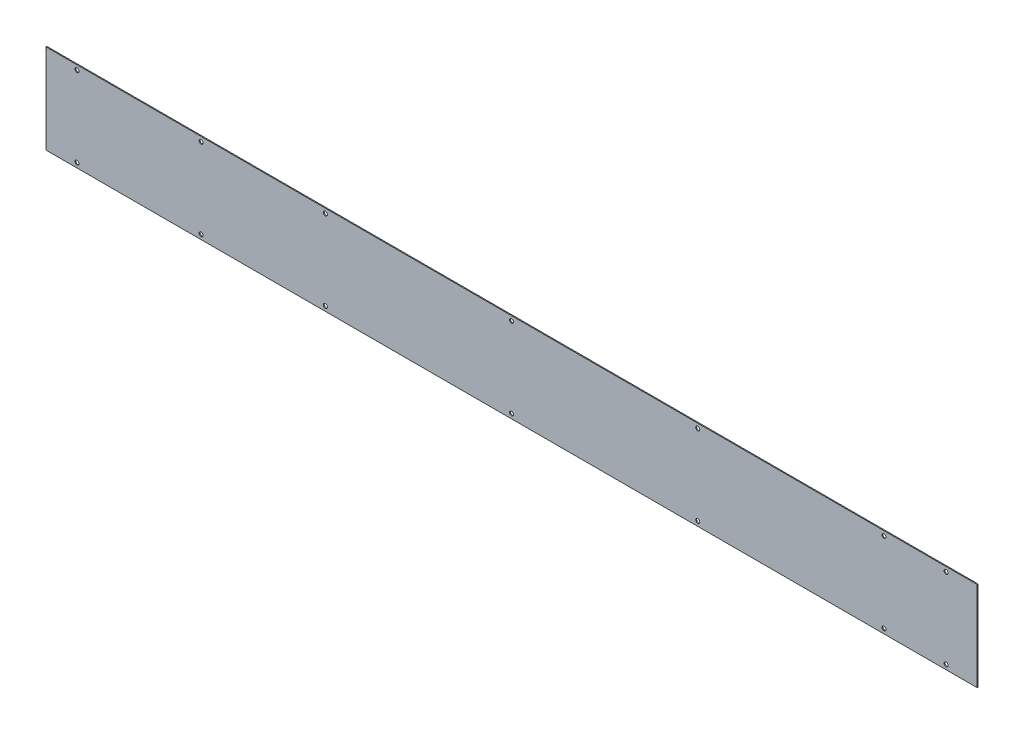
ISO-10303-21;
HEADER;
FILE_DESCRIPTION(('STEP AP214'),'2;1');
FILE_NAME('part.step','',(''),(''),'','','');
FILE_SCHEMA(('AUTOMOTIVE_DESIGN { 1 0 10303 214 1 1 1 1 }'));
ENDSEC;
DATA;
#1=APPLICATION_CONTEXT('core data for automotive mechanical design processes');
#2=APPLICATION_PROTOCOL_DEFINITION('international standard','automotive_design',2000,#1);
#3=PRODUCT_CONTEXT('',#1,'mechanical');
#4=PRODUCT('Part','Part','',(#3));
#5=PRODUCT_RELATED_PRODUCT_CATEGORY('part','',(#4));
#6=PRODUCT_DEFINITION_FORMATION('','',#4);
#7=PRODUCT_DEFINITION_CONTEXT('part definition',#1,'design');
#8=PRODUCT_DEFINITION('design','',#6,#7);
#9=PRODUCT_DEFINITION_SHAPE('','',#8);
#10=(LENGTH_UNIT() NAMED_UNIT(*) SI_UNIT(.MILLI.,.METRE.));
#11=(NAMED_UNIT(*) PLANE_ANGLE_UNIT() SI_UNIT($,.RADIAN.));
#12=(NAMED_UNIT(*) SI_UNIT($,.STERADIAN.) SOLID_ANGLE_UNIT());
#13=UNCERTAINTY_MEASURE_WITH_UNIT(LENGTH_MEASURE(1.E-05),#10,'distance_accuracy_value','');
#14=(GEOMETRIC_REPRESENTATION_CONTEXT(3) GLOBAL_UNCERTAINTY_ASSIGNED_CONTEXT((#13)) GLOBAL_UNIT_ASSIGNED_CONTEXT((#10,
#11,#12)) REPRESENTATION_CONTEXT('',''));
#15=CARTESIAN_POINT('',(0.,0.,0.));
#16=DIRECTION('',(0.,0.,1.));
#17=DIRECTION('',(1.,0.,0.));
#18=AXIS2_PLACEMENT_3D('',#15,#16,#17);
#19=CARTESIAN_POINT('',(381.,-36.5759999999997,-0.75946));
#20=DIRECTION('',(1.,0.,0.));
#21=DIRECTION('',(0.,1.,0.));
#22=AXIS2_PLACEMENT_3D('',#19,#20,#21);
#23=PLANE('',#22);
#24=DIRECTION('',(0.,1.,0.));
#25=VECTOR('',#24,1.);
#26=CARTESIAN_POINT('',(381.,-36.5759999999997,0.));
#27=LINE('',#26,#25);
#28=CARTESIAN_POINT('',(381.,-36.5759999999997,0.));
#29=VERTEX_POINT('',#28);
#30=CARTESIAN_POINT('',(381.,36.5759999999998,0.));
#31=VERTEX_POINT('',#30);
#32=EDGE_CURVE('E106',#29,#31,#27,.T.);
#33=ORIENTED_EDGE('',*,*,#32,.F.);
#34=DIRECTION('',(0.,0.,1.));
#35=VECTOR('',#34,1.);
#36=CARTESIAN_POINT('',(381.,-36.5759999999997,-0.75946));
#37=LINE('',#36,#35);
#38=CARTESIAN_POINT('',(381.,-36.5759999999997,-0.75946));
#39=VERTEX_POINT('',#38);
#40=EDGE_CURVE('E11',#39,#29,#37,.T.);
#41=ORIENTED_EDGE('',*,*,#40,.F.);
#42=DIRECTION('',(0.,1.,0.));
#43=VECTOR('',#42,1.);
#44=CARTESIAN_POINT('',(381.,-36.5759999999997,-0.75946));
#45=LINE('',#44,#43);
#46=CARTESIAN_POINT('',(381.,36.5759999999998,-0.75946));
#47=VERTEX_POINT('',#46);
#48=EDGE_CURVE('E99',#39,#47,#45,.T.);
#49=ORIENTED_EDGE('',*,*,#48,.T.);
#50=DIRECTION('',(0.,0.,1.));
#51=VECTOR('',#50,1.);
#52=CARTESIAN_POINT('',(381.,36.5759999999998,-0.75946));
#53=LINE('',#52,#51);
#54=EDGE_CURVE('E44',#47,#31,#53,.T.);
#55=ORIENTED_EDGE('',*,*,#54,.T.);
#56=EDGE_LOOP('',(#33,#41,#49,#55));
#57=FACE_BOUND('',#56,.T.);
#58=ADVANCED_FACE('F41',(#57),#23,.T.);
#59=CARTESIAN_POINT('',(-381.,-36.5759999999997,-0.75946));
#60=DIRECTION('',(0.,-1.,0.));
#61=DIRECTION('',(0.,0.,-1.));
#62=AXIS2_PLACEMENT_3D('',#59,#60,#61);
#63=PLANE('',#62);
#64=DIRECTION('',(1.,0.,0.));
#65=VECTOR('',#64,1.);
#66=CARTESIAN_POINT('',(-381.,-36.5759999999997,0.));
#67=LINE('',#66,#65);
#68=CARTESIAN_POINT('',(-381.,-36.5759999999997,0.));
#69=VERTEX_POINT('',#68);
#70=EDGE_CURVE('E101',#69,#29,#67,.T.);
#71=ORIENTED_EDGE('',*,*,#70,.F.);
#72=DIRECTION('',(0.,0.,1.));
#73=VECTOR('',#72,1.);
#74=CARTESIAN_POINT('',(-381.,-36.5759999999997,-0.75946));
#75=LINE('',#74,#73);
#76=CARTESIAN_POINT('',(-381.,-36.5759999999997,-0.75946));
#77=VERTEX_POINT('',#76);
#78=EDGE_CURVE('E50',#77,#69,#75,.T.);
#79=ORIENTED_EDGE('',*,*,#78,.F.);
#80=DIRECTION('',(1.,0.,0.));
#81=VECTOR('',#80,1.);
#82=CARTESIAN_POINT('',(-381.,-36.5759999999997,-0.75946));
#83=LINE('',#82,#81);
#84=EDGE_CURVE('E96',#77,#39,#83,.T.);
#85=ORIENTED_EDGE('',*,*,#84,.T.);
#86=ORIENTED_EDGE('',*,*,#40,.T.);
#87=EDGE_LOOP('',(#71,#79,#85,#86));
#88=FACE_BOUND('',#87,.T.);
#89=ADVANCED_FACE('F117',(#88),#63,.T.);
#90=CARTESIAN_POINT('',(-381.,-36.5759999999997,-0.75946));
#91=DIRECTION('',(-1.,0.,0.));
#92=DIRECTION('',(0.,0.,1.));
#93=AXIS2_PLACEMENT_3D('',#90,#91,#92);
#94=PLANE('',#93);
#95=DIRECTION('',(0.,-1.,0.));
#96=VECTOR('',#95,1.);
#97=CARTESIAN_POINT('',(-381.,-36.5759999999997,0.));
#98=LINE('',#97,#96);
#99=CARTESIAN_POINT('',(-381.,36.5760000000003,0.));
#100=VERTEX_POINT('',#99);
#101=EDGE_CURVE('E91',#100,#69,#98,.T.);
#102=ORIENTED_EDGE('',*,*,#101,.F.);
#103=DIRECTION('',(0.,0.,1.));
#104=VECTOR('',#103,1.);
#105=CARTESIAN_POINT('',(-381.,36.5760000000003,-0.75946));
#106=LINE('',#105,#104);
#107=CARTESIAN_POINT('',(-381.,36.5760000000003,-0.75946));
#108=VERTEX_POINT('',#107);
#109=EDGE_CURVE('E86',#108,#100,#106,.T.);
#110=ORIENTED_EDGE('',*,*,#109,.F.);
#111=DIRECTION('',(0.,-1.,0.));
#112=VECTOR('',#111,1.);
#113=CARTESIAN_POINT('',(-381.,-36.5759999999997,-0.75946));
#114=LINE('',#113,#112);
#115=EDGE_CURVE('E89',#108,#77,#114,.T.);
#116=ORIENTED_EDGE('',*,*,#115,.T.);
#117=ORIENTED_EDGE('',*,*,#78,.T.);
#118=EDGE_LOOP('',(#102,#110,#116,#117));
#119=FACE_BOUND('',#118,.T.);
#120=ADVANCED_FACE('F88',(#119),#94,.T.);
#121=CARTESIAN_POINT('',(-381.,36.5760000000003,-0.75946));
#122=DIRECTION('',(0.,1.,0.));
#123=DIRECTION('',(-1.,0.,0.));
#124=AXIS2_PLACEMENT_3D('',#121,#122,#123);
#125=PLANE('',#124);
#126=DIRECTION('',(-1.,0.,0.));
#127=VECTOR('',#126,1.);
#128=CARTESIAN_POINT('',(-381.,36.5760000000003,0.));
#129=LINE('',#128,#127);
#130=EDGE_CURVE('E109',#31,#100,#129,.T.);
#131=ORIENTED_EDGE('',*,*,#130,.F.);
#132=ORIENTED_EDGE('',*,*,#54,.F.);
#133=DIRECTION('',(-1.,0.,0.));
#134=VECTOR('',#133,1.);
#135=CARTESIAN_POINT('',(-381.,36.5760000000003,-0.75946));
#136=LINE('',#135,#134);
#137=EDGE_CURVE('E95',#47,#108,#136,.T.);
#138=ORIENTED_EDGE('',*,*,#137,.T.);
#139=ORIENTED_EDGE('',*,*,#109,.T.);
#140=EDGE_LOOP('',(#131,#132,#138,#139));
#141=FACE_BOUND('',#140,.T.);
#142=ADVANCED_FACE('F98',(#141),#125,.T.);
#143=CARTESIAN_POINT('',(0.,0.,-0.75946));
#144=DIRECTION('',(0.,0.,-1.));
#145=DIRECTION('',(-1.,0.,0.));
#146=AXIS2_PLACEMENT_3D('',#143,#144,#145);
#147=PLANE('',#146);
#148=CARTESIAN_POINT('',(-1.11022302462516E-13,-32.7659999999997,-0.75946));
#149=DIRECTION('',(0.,0.,1.));
#150=DIRECTION('',(1.,0.,0.));
#151=AXIS2_PLACEMENT_3D('',#148,#149,#150);
#152=CIRCLE('',#151,1.65100000000002);
#153=CARTESIAN_POINT('',(1.65099999999991,-32.7659999999997,-0.75946));
#154=VERTEX_POINT('',#153);
#155=EDGE_CURVE('E244',#154,#154,#152,.T.);
#156=ORIENTED_EDGE('',*,*,#155,.T.);
#157=EDGE_LOOP('',(#156));
#158=FACE_BOUND('',#157,.T.);
#159=CARTESIAN_POINT('',(355.6,32.7659999999998,-0.75946));
#160=DIRECTION('',(0.,0.,1.));
#161=DIRECTION('',(1.,0.,0.));
#162=AXIS2_PLACEMENT_3D('',#159,#160,#161);
#163=CIRCLE('',#162,1.65100000000002);
#164=CARTESIAN_POINT('',(357.251,32.7659999999998,-0.75946));
#165=VERTEX_POINT('',#164);
#166=EDGE_CURVE('E250',#165,#165,#163,.T.);
#167=ORIENTED_EDGE('',*,*,#166,.T.);
#168=EDGE_LOOP('',(#167));
#169=FACE_BOUND('',#168,.T.);
#170=CARTESIAN_POINT('',(355.6,-32.7659999999997,-0.75946));
#171=DIRECTION('',(0.,0.,1.));
#172=DIRECTION('',(1.,0.,0.));
#173=AXIS2_PLACEMENT_3D('',#170,#171,#172);
#174=CIRCLE('',#173,1.65100000000002);
#175=CARTESIAN_POINT('',(357.251,-32.7659999999997,-0.75946));
#176=VERTEX_POINT('',#175);
#177=EDGE_CURVE('E232',#176,#176,#174,.T.);
#178=ORIENTED_EDGE('',*,*,#177,.T.);
#179=EDGE_LOOP('',(#178));
#180=FACE_BOUND('',#179,.T.);
#181=CARTESIAN_POINT('',(152.4,32.7659999999998,-0.75946));
#182=DIRECTION('',(0.,0.,1.));
#183=DIRECTION('',(1.,0.,0.));
#184=AXIS2_PLACEMENT_3D('',#181,#182,#183);
#185=CIRCLE('',#184,1.65100000000002);
#186=CARTESIAN_POINT('',(154.051,32.7659999999998,-0.75946));
#187=VERTEX_POINT('',#186);
#188=EDGE_CURVE('E239',#187,#187,#185,.T.);
#189=ORIENTED_EDGE('',*,*,#188,.T.);
#190=EDGE_LOOP('',(#189));
#191=FACE_BOUND('',#190,.T.);
#192=CARTESIAN_POINT('',(304.8,-32.7659999999997,-0.75946));
#193=DIRECTION('',(0.,0.,1.));
#194=DIRECTION('',(1.,0.,0.));
#195=AXIS2_PLACEMENT_3D('',#192,#193,#194);
#196=CIRCLE('',#195,1.65100000000002);
#197=CARTESIAN_POINT('',(306.451,-32.7659999999997,-0.75946));
#198=VERTEX_POINT('',#197);
#199=EDGE_CURVE('E274',#198,#198,#196,.T.);
#200=ORIENTED_EDGE('',*,*,#199,.T.);
#201=EDGE_LOOP('',(#200));
#202=FACE_BOUND('',#201,.T.);
#203=CARTESIAN_POINT('',(304.8,32.7659999999998,-0.75946));
#204=DIRECTION('',(0.,0.,1.));
#205=DIRECTION('',(1.,0.,0.));
#206=AXIS2_PLACEMENT_3D('',#203,#204,#205);
#207=CIRCLE('',#206,1.65100000000002);
#208=CARTESIAN_POINT('',(306.451,32.7659999999998,-0.75946));
#209=VERTEX_POINT('',#208);
#210=EDGE_CURVE('E268',#209,#209,#207,.T.);
#211=ORIENTED_EDGE('',*,*,#210,.T.);
#212=EDGE_LOOP('',(#211));
#213=FACE_BOUND('',#212,.T.);
#214=CARTESIAN_POINT('',(-1.11022302462516E-13,32.7659999999998,-0.75946));
#215=DIRECTION('',(0.,0.,1.));
#216=DIRECTION('',(1.,0.,0.));
#217=AXIS2_PLACEMENT_3D('',#214,#215,#216);
#218=CIRCLE('',#217,1.65099999999999);
#219=CARTESIAN_POINT('',(1.65099999999988,32.7659999999998,-0.75946));
#220=VERTEX_POINT('',#219);
#221=EDGE_CURVE('E262',#220,#220,#218,.T.);
#222=ORIENTED_EDGE('',*,*,#221,.T.);
#223=EDGE_LOOP('',(#222));
#224=FACE_BOUND('',#223,.T.);
#225=CARTESIAN_POINT('',(-254.,-32.7659999999997,-0.75946));
#226=DIRECTION('',(0.,0.,1.));
#227=DIRECTION('',(1.,0.,0.));
#228=AXIS2_PLACEMENT_3D('',#225,#226,#227);
#229=CIRCLE('',#228,1.65100000000002);
#230=CARTESIAN_POINT('',(-252.349,-32.7659999999997,-0.75946));
#231=VERTEX_POINT('',#230);
#232=EDGE_CURVE('E255',#231,#231,#229,.T.);
#233=ORIENTED_EDGE('',*,*,#232,.T.);
#234=EDGE_LOOP('',(#233));
#235=FACE_BOUND('',#234,.T.);
#236=CARTESIAN_POINT('',(-355.6,-32.7659999999997,-0.75946));
#237=DIRECTION('',(0.,0.,1.));
#238=DIRECTION('',(1.,0.,0.));
#239=AXIS2_PLACEMENT_3D('',#236,#237,#238);
#240=CIRCLE('',#239,1.65100000000002);
#241=CARTESIAN_POINT('',(-353.949,-32.7659999999997,-0.75946));
#242=VERTEX_POINT('',#241);
#243=EDGE_CURVE('E199',#242,#242,#240,.T.);
#244=ORIENTED_EDGE('',*,*,#243,.T.);
#245=EDGE_LOOP('',(#244));
#246=FACE_BOUND('',#245,.T.);
#247=CARTESIAN_POINT('',(152.4,-32.7659999999997,-0.75946));
#248=DIRECTION('',(0.,0.,1.));
#249=DIRECTION('',(1.,0.,0.));
#250=AXIS2_PLACEMENT_3D('',#247,#248,#249);
#251=CIRCLE('',#250,1.65100000000002);
#252=CARTESIAN_POINT('',(154.051,-32.7659999999997,-0.75946));
#253=VERTEX_POINT('',#252);
#254=EDGE_CURVE('E220',#253,#253,#251,.T.);
#255=ORIENTED_EDGE('',*,*,#254,.T.);
#256=EDGE_LOOP('',(#255));
#257=FACE_BOUND('',#256,.T.);
#258=CARTESIAN_POINT('',(-152.4,32.7659999999998,-0.75946));
#259=DIRECTION('',(0.,0.,1.));
#260=DIRECTION('',(1.,0.,0.));
#261=AXIS2_PLACEMENT_3D('',#258,#259,#260);
#262=CIRCLE('',#261,1.65100000000002);
#263=CARTESIAN_POINT('',(-150.749,32.7659999999998,-0.75946));
#264=VERTEX_POINT('',#263);
#265=EDGE_CURVE('E227',#264,#264,#262,.T.);
#266=ORIENTED_EDGE('',*,*,#265,.T.);
#267=EDGE_LOOP('',(#266));
#268=FACE_BOUND('',#267,.T.);
#269=CARTESIAN_POINT('',(-152.4,-32.7659999999997,-0.75946));
#270=DIRECTION('',(0.,0.,1.));
#271=DIRECTION('',(1.,0.,0.));
#272=AXIS2_PLACEMENT_3D('',#269,#270,#271);
#273=CIRCLE('',#272,1.65100000000002);
#274=CARTESIAN_POINT('',(-150.749,-32.7659999999997,-0.75946));
#275=VERTEX_POINT('',#274);
#276=EDGE_CURVE('E208',#275,#275,#273,.T.);
#277=ORIENTED_EDGE('',*,*,#276,.T.);
#278=EDGE_LOOP('',(#277));
#279=FACE_BOUND('',#278,.T.);
#280=CARTESIAN_POINT('',(-355.6,32.7659999999998,-0.75946));
#281=DIRECTION('',(0.,0.,1.));
#282=DIRECTION('',(1.,0.,0.));
#283=AXIS2_PLACEMENT_3D('',#280,#281,#282);
#284=CIRCLE('',#283,1.65100000000002);
#285=CARTESIAN_POINT('',(-353.949,32.7659999999998,-0.75946));
#286=VERTEX_POINT('',#285);
#287=EDGE_CURVE('E215',#286,#286,#284,.T.);
#288=ORIENTED_EDGE('',*,*,#287,.T.);
#289=EDGE_LOOP('',(#288));
#290=FACE_BOUND('',#289,.T.);
#291=CARTESIAN_POINT('',(-254.,32.7659999999998,-0.75946));
#292=DIRECTION('',(0.,0.,1.));
#293=DIRECTION('',(1.,0.,0.));
#294=AXIS2_PLACEMENT_3D('',#291,#292,#293);
#295=CIRCLE('',#294,1.65100000000002);
#296=CARTESIAN_POINT('',(-252.349,32.7659999999998,-0.75946));
#297=VERTEX_POINT('',#296);
#298=EDGE_CURVE('E110',#297,#297,#295,.T.);
#299=ORIENTED_EDGE('',*,*,#298,.T.);
#300=EDGE_LOOP('',(#299));
#301=FACE_BOUND('',#300,.T.);
#302=ORIENTED_EDGE('',*,*,#48,.F.);
#303=ORIENTED_EDGE('',*,*,#84,.F.);
#304=ORIENTED_EDGE('',*,*,#115,.F.);
#305=ORIENTED_EDGE('',*,*,#137,.F.);
#306=EDGE_LOOP('',(#302,#303,#304,#305));
#307=FACE_BOUND('',#306,.T.);
#308=ADVANCED_FACE('F94',(#158,#169,#180,#191,#202,#213,#224,#235,#246,#257,#268,#279,#290,#301,
#307),#147,.T.);
#309=CARTESIAN_POINT('',(0.,0.,0.));
#310=DIRECTION('',(0.,0.,-1.));
#311=DIRECTION('',(-1.,0.,0.));
#312=AXIS2_PLACEMENT_3D('',#309,#310,#311);
#313=PLANE('',#312);
#314=CARTESIAN_POINT('',(-1.11022302462516E-13,-32.7659999999997,0.));
#315=DIRECTION('',(0.,0.,1.));
#316=DIRECTION('',(1.,0.,0.));
#317=AXIS2_PLACEMENT_3D('',#314,#315,#316);
#318=CIRCLE('',#317,1.65100000000002);
#319=CARTESIAN_POINT('',(1.65099999999991,-32.7659999999997,0.));
#320=VERTEX_POINT('',#319);
#321=EDGE_CURVE('E247',#320,#320,#318,.T.);
#322=ORIENTED_EDGE('',*,*,#321,.F.);
#323=EDGE_LOOP('',(#322));
#324=FACE_BOUND('',#323,.T.);
#325=CARTESIAN_POINT('',(355.6,32.7659999999998,0.));
#326=DIRECTION('',(0.,0.,1.));
#327=DIRECTION('',(1.,0.,0.));
#328=AXIS2_PLACEMENT_3D('',#325,#326,#327);
#329=CIRCLE('',#328,1.65100000000002);
#330=CARTESIAN_POINT('',(357.251,32.7659999999998,0.));
#331=VERTEX_POINT('',#330);
#332=EDGE_CURVE('E235',#331,#331,#329,.T.);
#333=ORIENTED_EDGE('',*,*,#332,.F.);
#334=EDGE_LOOP('',(#333));
#335=FACE_BOUND('',#334,.T.);
#336=CARTESIAN_POINT('',(355.6,-32.7659999999997,0.));
#337=DIRECTION('',(0.,0.,1.));
#338=DIRECTION('',(1.,0.,0.));
#339=AXIS2_PLACEMENT_3D('',#336,#337,#338);
#340=CIRCLE('',#339,1.65100000000002);
#341=CARTESIAN_POINT('',(357.251,-32.7659999999997,0.));
#342=VERTEX_POINT('',#341);
#343=EDGE_CURVE('E236',#342,#342,#340,.T.);
#344=ORIENTED_EDGE('',*,*,#343,.F.);
#345=EDGE_LOOP('',(#344));
#346=FACE_BOUND('',#345,.T.);
#347=CARTESIAN_POINT('',(152.4,32.7659999999998,0.));
#348=DIRECTION('',(0.,0.,1.));
#349=DIRECTION('',(1.,0.,0.));
#350=AXIS2_PLACEMENT_3D('',#347,#348,#349);
#351=CIRCLE('',#350,1.65100000000002);
#352=CARTESIAN_POINT('',(154.051,32.7659999999998,0.));
#353=VERTEX_POINT('',#352);
#354=EDGE_CURVE('E223',#353,#353,#351,.T.);
#355=ORIENTED_EDGE('',*,*,#354,.F.);
#356=EDGE_LOOP('',(#355));
#357=FACE_BOUND('',#356,.T.);
#358=CARTESIAN_POINT('',(304.8,-32.7659999999997,0.));
#359=DIRECTION('',(0.,0.,1.));
#360=DIRECTION('',(1.,0.,0.));
#361=AXIS2_PLACEMENT_3D('',#358,#359,#360);
#362=CIRCLE('',#361,1.65100000000002);
#363=CARTESIAN_POINT('',(306.451,-32.7659999999997,0.));
#364=VERTEX_POINT('',#363);
#365=EDGE_CURVE('E246',#364,#364,#362,.T.);
#366=ORIENTED_EDGE('',*,*,#365,.F.);
#367=EDGE_LOOP('',(#366));
#368=FACE_BOUND('',#367,.T.);
#369=CARTESIAN_POINT('',(304.8,32.7659999999998,0.));
#370=DIRECTION('',(0.,0.,1.));
#371=DIRECTION('',(1.,0.,0.));
#372=AXIS2_PLACEMENT_3D('',#369,#370,#371);
#373=CIRCLE('',#372,1.65100000000002);
#374=CARTESIAN_POINT('',(306.451,32.7659999999998,0.));
#375=VERTEX_POINT('',#374);
#376=EDGE_CURVE('E271',#375,#375,#373,.T.);
#377=ORIENTED_EDGE('',*,*,#376,.F.);
#378=EDGE_LOOP('',(#377));
#379=FACE_BOUND('',#378,.T.);
#380=CARTESIAN_POINT('',(-1.11022302462516E-13,32.7659999999998,0.));
#381=DIRECTION('',(0.,0.,1.));
#382=DIRECTION('',(1.,0.,0.));
#383=AXIS2_PLACEMENT_3D('',#380,#381,#382);
#384=CIRCLE('',#383,1.65099999999999);
#385=CARTESIAN_POINT('',(1.65099999999988,32.7659999999998,0.));
#386=VERTEX_POINT('',#385);
#387=EDGE_CURVE('E265',#386,#386,#384,.T.);
#388=ORIENTED_EDGE('',*,*,#387,.F.);
#389=EDGE_LOOP('',(#388));
#390=FACE_BOUND('',#389,.T.);
#391=CARTESIAN_POINT('',(-254.,-32.7659999999997,0.));
#392=DIRECTION('',(0.,0.,1.));
#393=DIRECTION('',(1.,0.,0.));
#394=AXIS2_PLACEMENT_3D('',#391,#392,#393);
#395=CIRCLE('',#394,1.65100000000002);
#396=CARTESIAN_POINT('',(-252.349,-32.7659999999997,0.));
#397=VERTEX_POINT('',#396);
#398=EDGE_CURVE('E259',#397,#397,#395,.T.);
#399=ORIENTED_EDGE('',*,*,#398,.F.);
#400=EDGE_LOOP('',(#399));
#401=FACE_BOUND('',#400,.T.);
#402=CARTESIAN_POINT('',(-355.6,-32.7659999999997,0.));
#403=DIRECTION('',(0.,0.,1.));
#404=DIRECTION('',(1.,0.,0.));
#405=AXIS2_PLACEMENT_3D('',#402,#403,#404);
#406=CIRCLE('',#405,1.65100000000002);
#407=CARTESIAN_POINT('',(-353.949,-32.7659999999997,0.));
#408=VERTEX_POINT('',#407);
#409=EDGE_CURVE('E202',#408,#408,#406,.T.);
#410=ORIENTED_EDGE('',*,*,#409,.F.);
#411=EDGE_LOOP('',(#410));
#412=FACE_BOUND('',#411,.T.);
#413=CARTESIAN_POINT('',(152.4,-32.7659999999997,0.));
#414=DIRECTION('',(0.,0.,1.));
#415=DIRECTION('',(1.,0.,0.));
#416=AXIS2_PLACEMENT_3D('',#413,#414,#415);
#417=CIRCLE('',#416,1.65100000000002);
#418=CARTESIAN_POINT('',(154.051,-32.7659999999997,0.));
#419=VERTEX_POINT('',#418);
#420=EDGE_CURVE('E224',#419,#419,#417,.T.);
#421=ORIENTED_EDGE('',*,*,#420,.F.);
#422=EDGE_LOOP('',(#421));
#423=FACE_BOUND('',#422,.T.);
#424=CARTESIAN_POINT('',(-152.4,32.7659999999998,0.));
#425=DIRECTION('',(0.,0.,1.));
#426=DIRECTION('',(1.,0.,0.));
#427=AXIS2_PLACEMENT_3D('',#424,#425,#426);
#428=CIRCLE('',#427,1.65100000000002);
#429=CARTESIAN_POINT('',(-150.749,32.7659999999998,0.));
#430=VERTEX_POINT('',#429);
#431=EDGE_CURVE('E211',#430,#430,#428,.T.);
#432=ORIENTED_EDGE('',*,*,#431,.F.);
#433=EDGE_LOOP('',(#432));
#434=FACE_BOUND('',#433,.T.);
#435=CARTESIAN_POINT('',(-152.4,-32.7659999999997,0.));
#436=DIRECTION('',(0.,0.,1.));
#437=DIRECTION('',(1.,0.,0.));
#438=AXIS2_PLACEMENT_3D('',#435,#436,#437);
#439=CIRCLE('',#438,1.65100000000002);
#440=CARTESIAN_POINT('',(-150.749,-32.7659999999997,0.));
#441=VERTEX_POINT('',#440);
#442=EDGE_CURVE('E212',#441,#441,#439,.T.);
#443=ORIENTED_EDGE('',*,*,#442,.F.);
#444=EDGE_LOOP('',(#443));
#445=FACE_BOUND('',#444,.T.);
#446=CARTESIAN_POINT('',(-355.6,32.7659999999998,0.));
#447=DIRECTION('',(0.,0.,1.));
#448=DIRECTION('',(1.,0.,0.));
#449=AXIS2_PLACEMENT_3D('',#446,#447,#448);
#450=CIRCLE('',#449,1.65100000000002);
#451=CARTESIAN_POINT('',(-353.949,32.7659999999998,0.));
#452=VERTEX_POINT('',#451);
#453=EDGE_CURVE('E205',#452,#452,#450,.T.);
#454=ORIENTED_EDGE('',*,*,#453,.F.);
#455=EDGE_LOOP('',(#454));
#456=FACE_BOUND('',#455,.T.);
#457=CARTESIAN_POINT('',(-254.,32.7659999999998,0.));
#458=DIRECTION('',(0.,0.,1.));
#459=DIRECTION('',(1.,0.,0.));
#460=AXIS2_PLACEMENT_3D('',#457,#458,#459);
#461=CIRCLE('',#460,1.65100000000002);
#462=CARTESIAN_POINT('',(-252.349,32.7659999999998,0.));
#463=VERTEX_POINT('',#462);
#464=EDGE_CURVE('E258',#463,#463,#461,.T.);
#465=ORIENTED_EDGE('',*,*,#464,.F.);
#466=EDGE_LOOP('',(#465));
#467=FACE_BOUND('',#466,.T.);
#468=ORIENTED_EDGE('',*,*,#32,.T.);
#469=ORIENTED_EDGE('',*,*,#130,.T.);
#470=ORIENTED_EDGE('',*,*,#101,.T.);
#471=ORIENTED_EDGE('',*,*,#70,.T.);
#472=EDGE_LOOP('',(#468,#469,#470,#471));
#473=FACE_BOUND('',#472,.T.);
#474=ADVANCED_FACE('F116',(#324,#335,#346,#357,#368,#379,#390,#401,#412,#423,#434,#445,#456,
#467,#473),#313,.F.);
#475=CARTESIAN_POINT('',(-254.,32.7659999999998,-0.75946));
#476=DIRECTION('',(0.,0.,1.));
#477=DIRECTION('',(1.,0.,0.));
#478=AXIS2_PLACEMENT_3D('',#475,#476,#477);
#479=CYLINDRICAL_SURFACE('',#478,1.65100000000002);
#480=ORIENTED_EDGE('',*,*,#298,.F.);
#481=EDGE_LOOP('',(#480));
#482=FACE_BOUND('',#481,.T.);
#483=ORIENTED_EDGE('',*,*,#464,.T.);
#484=EDGE_LOOP('',(#483));
#485=FACE_BOUND('',#484,.T.);
#486=ADVANCED_FACE('F135',(#482,#485),#479,.F.);
#487=CARTESIAN_POINT('',(-355.6,32.7659999999998,-0.75946));
#488=DIRECTION('',(0.,0.,1.));
#489=DIRECTION('',(1.,0.,0.));
#490=AXIS2_PLACEMENT_3D('',#487,#488,#489);
#491=CYLINDRICAL_SURFACE('',#490,1.65100000000002);
#492=ORIENTED_EDGE('',*,*,#287,.F.);
#493=EDGE_LOOP('',(#492));
#494=FACE_BOUND('',#493,.T.);
#495=ORIENTED_EDGE('',*,*,#453,.T.);
#496=EDGE_LOOP('',(#495));
#497=FACE_BOUND('',#496,.T.);
#498=ADVANCED_FACE('F142',(#494,#497),#491,.F.);
#499=CARTESIAN_POINT('',(-152.4,-32.7659999999997,-0.75946));
#500=DIRECTION('',(0.,0.,1.));
#501=DIRECTION('',(1.,0.,0.));
#502=AXIS2_PLACEMENT_3D('',#499,#500,#501);
#503=CYLINDRICAL_SURFACE('',#502,1.65100000000002);
#504=ORIENTED_EDGE('',*,*,#276,.F.);
#505=EDGE_LOOP('',(#504));
#506=FACE_BOUND('',#505,.T.);
#507=ORIENTED_EDGE('',*,*,#442,.T.);
#508=EDGE_LOOP('',(#507));
#509=FACE_BOUND('',#508,.T.);
#510=ADVANCED_FACE('F181',(#506,#509),#503,.F.);
#511=CARTESIAN_POINT('',(-152.4,32.7659999999998,-0.75946));
#512=DIRECTION('',(0.,0.,1.));
#513=DIRECTION('',(1.,0.,0.));
#514=AXIS2_PLACEMENT_3D('',#511,#512,#513);
#515=CYLINDRICAL_SURFACE('',#514,1.65100000000002);
#516=ORIENTED_EDGE('',*,*,#265,.F.);
#517=EDGE_LOOP('',(#516));
#518=FACE_BOUND('',#517,.T.);
#519=ORIENTED_EDGE('',*,*,#431,.T.);
#520=EDGE_LOOP('',(#519));
#521=FACE_BOUND('',#520,.T.);
#522=ADVANCED_FACE('F177',(#518,#521),#515,.F.);
#523=CARTESIAN_POINT('',(152.4,-32.7659999999997,-0.75946));
#524=DIRECTION('',(0.,0.,1.));
#525=DIRECTION('',(1.,0.,0.));
#526=AXIS2_PLACEMENT_3D('',#523,#524,#525);
#527=CYLINDRICAL_SURFACE('',#526,1.65100000000002);
#528=ORIENTED_EDGE('',*,*,#254,.F.);
#529=EDGE_LOOP('',(#528));
#530=FACE_BOUND('',#529,.T.);
#531=ORIENTED_EDGE('',*,*,#420,.T.);
#532=EDGE_LOOP('',(#531));
#533=FACE_BOUND('',#532,.T.);
#534=ADVANCED_FACE('F180',(#530,#533),#527,.F.);
#535=CARTESIAN_POINT('',(-355.6,-32.7659999999997,-0.75946));
#536=DIRECTION('',(0.,0.,1.));
#537=DIRECTION('',(1.,0.,0.));
#538=AXIS2_PLACEMENT_3D('',#535,#536,#537);
#539=CYLINDRICAL_SURFACE('',#538,1.65100000000002);
#540=ORIENTED_EDGE('',*,*,#243,.F.);
#541=EDGE_LOOP('',(#540));
#542=FACE_BOUND('',#541,.T.);
#543=ORIENTED_EDGE('',*,*,#409,.T.);
#544=EDGE_LOOP('',(#543));
#545=FACE_BOUND('',#544,.T.);
#546=ADVANCED_FACE('F160',(#542,#545),#539,.F.);
#547=CARTESIAN_POINT('',(-254.,-32.7659999999997,-0.75946));
#548=DIRECTION('',(0.,0.,1.));
#549=DIRECTION('',(1.,0.,0.));
#550=AXIS2_PLACEMENT_3D('',#547,#548,#549);
#551=CYLINDRICAL_SURFACE('',#550,1.65100000000002);
#552=ORIENTED_EDGE('',*,*,#232,.F.);
#553=EDGE_LOOP('',(#552));
#554=FACE_BOUND('',#553,.T.);
#555=ORIENTED_EDGE('',*,*,#398,.T.);
#556=EDGE_LOOP('',(#555));
#557=FACE_BOUND('',#556,.T.);
#558=ADVANCED_FACE('F156',(#554,#557),#551,.F.);
#559=CARTESIAN_POINT('',(-1.11022302462516E-13,32.7659999999998,-0.75946));
#560=DIRECTION('',(0.,0.,1.));
#561=DIRECTION('',(1.,0.,0.));
#562=AXIS2_PLACEMENT_3D('',#559,#560,#561);
#563=CYLINDRICAL_SURFACE('',#562,1.65099999999999);
#564=ORIENTED_EDGE('',*,*,#221,.F.);
#565=EDGE_LOOP('',(#564));
#566=FACE_BOUND('',#565,.T.);
#567=ORIENTED_EDGE('',*,*,#387,.T.);
#568=EDGE_LOOP('',(#567));
#569=FACE_BOUND('',#568,.T.);
#570=ADVANCED_FACE('F152',(#566,#569),#563,.F.);
#571=CARTESIAN_POINT('',(304.8,32.7659999999998,-0.75946));
#572=DIRECTION('',(0.,0.,1.));
#573=DIRECTION('',(1.,0.,0.));
#574=AXIS2_PLACEMENT_3D('',#571,#572,#573);
#575=CYLINDRICAL_SURFACE('',#574,1.65100000000002);
#576=ORIENTED_EDGE('',*,*,#210,.F.);
#577=EDGE_LOOP('',(#576));
#578=FACE_BOUND('',#577,.T.);
#579=ORIENTED_EDGE('',*,*,#376,.T.);
#580=EDGE_LOOP('',(#579));
#581=FACE_BOUND('',#580,.T.);
#582=ADVANCED_FACE('F148',(#578,#581),#575,.F.);
#583=CARTESIAN_POINT('',(304.8,-32.7659999999997,-0.75946));
#584=DIRECTION('',(0.,0.,1.));
#585=DIRECTION('',(1.,0.,0.));
#586=AXIS2_PLACEMENT_3D('',#583,#584,#585);
#587=CYLINDRICAL_SURFACE('',#586,1.65100000000002);
#588=ORIENTED_EDGE('',*,*,#199,.F.);
#589=EDGE_LOOP('',(#588));
#590=FACE_BOUND('',#589,.T.);
#591=ORIENTED_EDGE('',*,*,#365,.T.);
#592=EDGE_LOOP('',(#591));
#593=FACE_BOUND('',#592,.T.);
#594=ADVANCED_FACE('F144',(#590,#593),#587,.F.);
#595=CARTESIAN_POINT('',(152.4,32.7659999999998,-0.75946));
#596=DIRECTION('',(0.,0.,1.));
#597=DIRECTION('',(1.,0.,0.));
#598=AXIS2_PLACEMENT_3D('',#595,#596,#597);
#599=CYLINDRICAL_SURFACE('',#598,1.65100000000002);
#600=ORIENTED_EDGE('',*,*,#188,.F.);
#601=EDGE_LOOP('',(#600));
#602=FACE_BOUND('',#601,.T.);
#603=ORIENTED_EDGE('',*,*,#354,.T.);
#604=EDGE_LOOP('',(#603));
#605=FACE_BOUND('',#604,.T.);
#606=ADVANCED_FACE('F147',(#602,#605),#599,.F.);
#607=CARTESIAN_POINT('',(355.6,-32.7659999999997,-0.75946));
#608=DIRECTION('',(0.,0.,1.));
#609=DIRECTION('',(1.,0.,0.));
#610=AXIS2_PLACEMENT_3D('',#607,#608,#609);
#611=CYLINDRICAL_SURFACE('',#610,1.65100000000002);
#612=ORIENTED_EDGE('',*,*,#177,.F.);
#613=EDGE_LOOP('',(#612));
#614=FACE_BOUND('',#613,.T.);
#615=ORIENTED_EDGE('',*,*,#343,.T.);
#616=EDGE_LOOP('',(#615));
#617=FACE_BOUND('',#616,.T.);
#618=ADVANCED_FACE('F166',(#614,#617),#611,.F.);
#619=CARTESIAN_POINT('',(355.6,32.7659999999998,-0.75946));
#620=DIRECTION('',(0.,0.,1.));
#621=DIRECTION('',(1.,0.,0.));
#622=AXIS2_PLACEMENT_3D('',#619,#620,#621);
#623=CYLINDRICAL_SURFACE('',#622,1.65100000000002);
#624=ORIENTED_EDGE('',*,*,#166,.F.);
#625=EDGE_LOOP('',(#624));
#626=FACE_BOUND('',#625,.T.);
#627=ORIENTED_EDGE('',*,*,#332,.T.);
#628=EDGE_LOOP('',(#627));
#629=FACE_BOUND('',#628,.T.);
#630=ADVANCED_FACE('F162',(#626,#629),#623,.F.);
#631=CARTESIAN_POINT('',(-1.11022302462516E-13,-32.7659999999997,-0.75946));
#632=DIRECTION('',(0.,0.,1.));
#633=DIRECTION('',(1.,0.,0.));
#634=AXIS2_PLACEMENT_3D('',#631,#632,#633);
#635=CYLINDRICAL_SURFACE('',#634,1.65100000000002);
#636=ORIENTED_EDGE('',*,*,#155,.F.);
#637=EDGE_LOOP('',(#636));
#638=FACE_BOUND('',#637,.T.);
#639=ORIENTED_EDGE('',*,*,#321,.T.);
#640=EDGE_LOOP('',(#639));
#641=FACE_BOUND('',#640,.T.);
#642=ADVANCED_FACE('F165',(#638,#641),#635,.F.);
#643=CLOSED_SHELL('',(#58,#89,#120,#142,#308,#474,#486,#498,#510,#522,#534,#546,#558,#570,#582,
#594,#606,#618,#630,#642));
#644=MANIFOLD_SOLID_BREP('B2',#643);
#645=ADVANCED_BREP_SHAPE_REPRESENTATION('',(#18,#644),#14);
#646=SHAPE_DEFINITION_REPRESENTATION(#9,#645);
ENDSEC;
END-ISO-10303-21;
